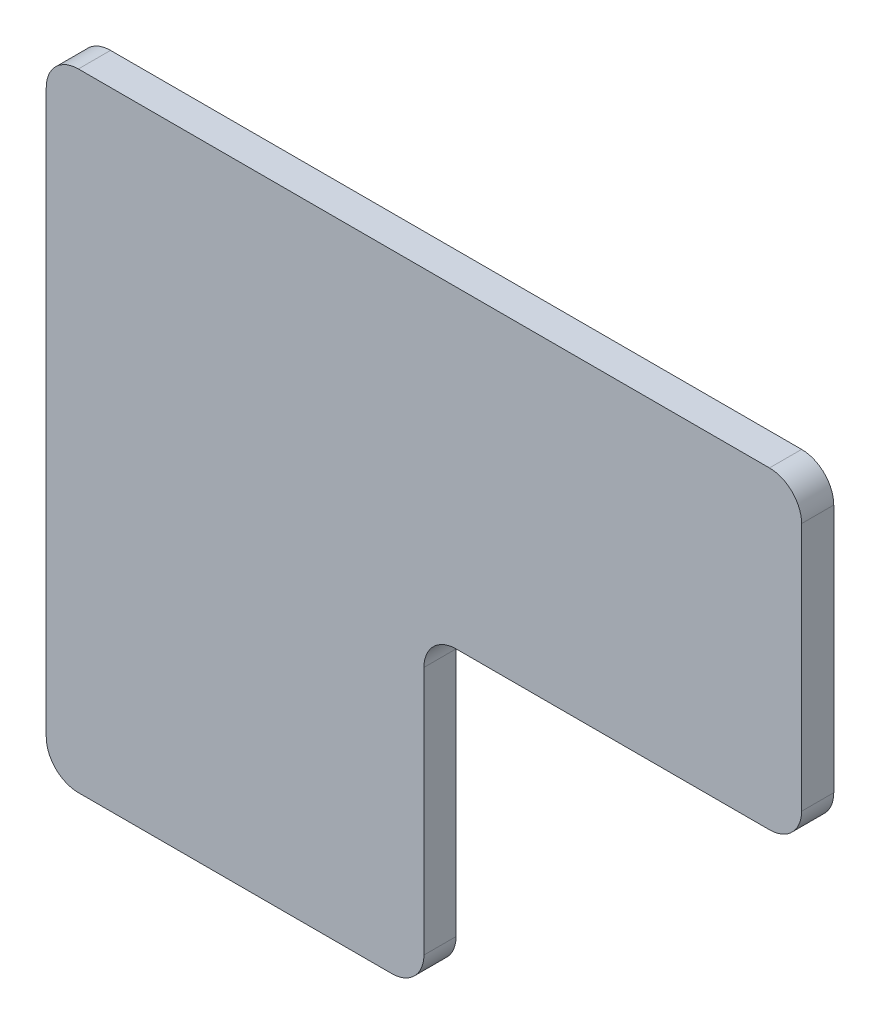
ISO-10303-21;
HEADER;
FILE_DESCRIPTION(('STEP AP214'),'2;1');
FILE_NAME('part.step','',(''),(''),'','','');
FILE_SCHEMA(('AUTOMOTIVE_DESIGN { 1 0 10303 214 1 1 1 1 }'));
ENDSEC;
DATA;
#1=APPLICATION_CONTEXT('core data for automotive mechanical design processes');
#2=APPLICATION_PROTOCOL_DEFINITION('international standard','automotive_design',2000,#1);
#3=PRODUCT_CONTEXT('',#1,'mechanical');
#4=PRODUCT('Part','Part','',(#3));
#5=PRODUCT_RELATED_PRODUCT_CATEGORY('part','',(#4));
#6=PRODUCT_DEFINITION_FORMATION('','',#4);
#7=PRODUCT_DEFINITION_CONTEXT('part definition',#1,'design');
#8=PRODUCT_DEFINITION('design','',#6,#7);
#9=PRODUCT_DEFINITION_SHAPE('','',#8);
#10=(LENGTH_UNIT() NAMED_UNIT(*) SI_UNIT(.MILLI.,.METRE.));
#11=(NAMED_UNIT(*) PLANE_ANGLE_UNIT() SI_UNIT($,.RADIAN.));
#12=(NAMED_UNIT(*) SI_UNIT($,.STERADIAN.) SOLID_ANGLE_UNIT());
#13=UNCERTAINTY_MEASURE_WITH_UNIT(LENGTH_MEASURE(1.E-05),#10,'distance_accuracy_value','');
#14=(GEOMETRIC_REPRESENTATION_CONTEXT(3) GLOBAL_UNCERTAINTY_ASSIGNED_CONTEXT((#13)) GLOBAL_UNIT_ASSIGNED_CONTEXT((#10,
#11,#12)) REPRESENTATION_CONTEXT('',''));
#15=CARTESIAN_POINT('',(0.,0.,0.));
#16=DIRECTION('',(0.,0.,1.));
#17=DIRECTION('',(1.,0.,0.));
#18=AXIS2_PLACEMENT_3D('',#15,#16,#17);
#19=CARTESIAN_POINT('',(0.,0.,16.));
#20=DIRECTION('',(0.,0.,1.));
#21=DIRECTION('',(1.,0.,0.));
#22=AXIS2_PLACEMENT_3D('',#19,#20,#21);
#23=PLANE('',#22);
#24=DIRECTION('',(1.,0.,0.));
#25=VECTOR('',#24,1.);
#26=CARTESIAN_POINT('',(-5.375,-4.875,16.));
#27=LINE('',#26,#25);
#28=CARTESIAN_POINT('',(-5.375,-4.875,16.));
#29=VERTEX_POINT('',#28);
#30=CARTESIAN_POINT('',(-0.5,-4.875,16.));
#31=VERTEX_POINT('',#30);
#32=EDGE_CURVE('E26',#29,#31,#27,.T.);
#33=ORIENTED_EDGE('',*,*,#32,.F.);
#34=CARTESIAN_POINT('',(-5.375,-4.375,16.));
#35=DIRECTION('',(0.,0.,1.));
#36=DIRECTION('',(-1.,0.,0.));
#37=AXIS2_PLACEMENT_3D('',#34,#35,#36);
#38=CIRCLE('',#37,0.5);
#39=CARTESIAN_POINT('',(-5.875,-4.375,16.));
#40=VERTEX_POINT('',#39);
#41=EDGE_CURVE('E282',#40,#29,#38,.T.);
#42=ORIENTED_EDGE('',*,*,#41,.F.);
#43=DIRECTION('',(0.,-1.,0.));
#44=VECTOR('',#43,1.);
#45=CARTESIAN_POINT('',(-5.875,4.375,16.));
#46=LINE('',#45,#44);
#47=CARTESIAN_POINT('',(-5.875,4.375,16.));
#48=VERTEX_POINT('',#47);
#49=EDGE_CURVE('E178',#48,#40,#46,.T.);
#50=ORIENTED_EDGE('',*,*,#49,.F.);
#51=CARTESIAN_POINT('',(-5.375,4.375,16.));
#52=DIRECTION('',(0.,0.,1.));
#53=DIRECTION('',(0.,1.,0.));
#54=AXIS2_PLACEMENT_3D('',#51,#52,#53);
#55=CIRCLE('',#54,0.5);
#56=CARTESIAN_POINT('',(-5.375,4.875,16.));
#57=VERTEX_POINT('',#56);
#58=EDGE_CURVE('E209',#57,#48,#55,.T.);
#59=ORIENTED_EDGE('',*,*,#58,.F.);
#60=DIRECTION('',(-1.,0.,0.));
#61=VECTOR('',#60,1.);
#62=CARTESIAN_POINT('',(5.375,4.875,16.));
#63=LINE('',#62,#61);
#64=CARTESIAN_POINT('',(5.375,4.875,16.));
#65=VERTEX_POINT('',#64);
#66=EDGE_CURVE('E249',#65,#57,#63,.T.);
#67=ORIENTED_EDGE('',*,*,#66,.F.);
#68=CARTESIAN_POINT('',(5.375,4.375,16.));
#69=DIRECTION('',(0.,0.,1.));
#70=DIRECTION('',(1.,0.,0.));
#71=AXIS2_PLACEMENT_3D('',#68,#69,#70);
#72=CIRCLE('',#71,0.5);
#73=CARTESIAN_POINT('',(5.875,4.375,16.));
#74=VERTEX_POINT('',#73);
#75=EDGE_CURVE('E227',#74,#65,#72,.T.);
#76=ORIENTED_EDGE('',*,*,#75,.F.);
#77=DIRECTION('',(0.,1.,0.));
#78=VECTOR('',#77,1.);
#79=CARTESIAN_POINT('',(5.875,-4.375,16.));
#80=LINE('',#79,#78);
#81=CARTESIAN_POINT('',(5.875,0.5,16.));
#82=VERTEX_POINT('',#81);
#83=EDGE_CURVE('E159',#82,#74,#80,.T.);
#84=ORIENTED_EDGE('',*,*,#83,.F.);
#85=CARTESIAN_POINT('',(5.375,0.5,16.));
#86=DIRECTION('',(0.,0.,1.));
#87=DIRECTION('',(0.,-1.,0.));
#88=AXIS2_PLACEMENT_3D('',#85,#86,#87);
#89=CIRCLE('',#88,0.5);
#90=CARTESIAN_POINT('',(5.375,0.,16.));
#91=VERTEX_POINT('',#90);
#92=EDGE_CURVE('E20',#91,#82,#89,.T.);
#93=ORIENTED_EDGE('',*,*,#92,.F.);
#94=DIRECTION('',(1.,0.,0.));
#95=VECTOR('',#94,1.);
#96=CARTESIAN_POINT('',(0.5,0.,16.));
#97=LINE('',#96,#95);
#98=CARTESIAN_POINT('',(0.5,0.,16.));
#99=VERTEX_POINT('',#98);
#100=EDGE_CURVE('E168',#99,#91,#97,.T.);
#101=ORIENTED_EDGE('',*,*,#100,.F.);
#102=CARTESIAN_POINT('',(0.5,-0.5,16.));
#103=DIRECTION('',(0.,0.,-1.));
#104=DIRECTION('',(0.,-1.,0.));
#105=AXIS2_PLACEMENT_3D('',#102,#103,#104);
#106=CIRCLE('',#105,0.5);
#107=CARTESIAN_POINT('',(0.,-0.5,16.));
#108=VERTEX_POINT('',#107);
#109=EDGE_CURVE('E173',#108,#99,#106,.T.);
#110=ORIENTED_EDGE('',*,*,#109,.F.);
#111=DIRECTION('',(0.,1.,0.));
#112=VECTOR('',#111,1.);
#113=CARTESIAN_POINT('',(0.,-4.375,16.));
#114=LINE('',#113,#112);
#115=CARTESIAN_POINT('',(0.,-4.375,16.));
#116=VERTEX_POINT('',#115);
#117=EDGE_CURVE('E185',#116,#108,#114,.T.);
#118=ORIENTED_EDGE('',*,*,#117,.F.);
#119=CARTESIAN_POINT('',(-0.5,-4.375,16.));
#120=DIRECTION('',(0.,0.,1.));
#121=DIRECTION('',(0.,-1.,0.));
#122=AXIS2_PLACEMENT_3D('',#119,#120,#121);
#123=CIRCLE('',#122,0.5);
#124=EDGE_CURVE('E195',#31,#116,#123,.T.);
#125=ORIENTED_EDGE('',*,*,#124,.F.);
#126=EDGE_LOOP('',(#33,#42,#50,#59,#67,#76,#84,#93,#101,#110,#118,#125));
#127=FACE_BOUND('',#126,.T.);
#128=ADVANCED_FACE('F16',(#127),#23,.F.);
#129=CARTESIAN_POINT('',(0.,0.,16.5));
#130=DIRECTION('',(0.,0.,1.));
#131=DIRECTION('',(1.,0.,0.));
#132=AXIS2_PLACEMENT_3D('',#129,#130,#131);
#133=PLANE('',#132);
#134=DIRECTION('',(1.,0.,0.));
#135=VECTOR('',#134,1.);
#136=CARTESIAN_POINT('',(-5.375,-4.875,16.5));
#137=LINE('',#136,#135);
#138=CARTESIAN_POINT('',(-5.375,-4.875,16.5));
#139=VERTEX_POINT('',#138);
#140=CARTESIAN_POINT('',(-0.5,-4.875,16.5));
#141=VERTEX_POINT('',#140);
#142=EDGE_CURVE('E11',#139,#141,#137,.T.);
#143=ORIENTED_EDGE('',*,*,#142,.T.);
#144=CARTESIAN_POINT('',(-0.5,-4.375,16.5));
#145=DIRECTION('',(0.,0.,1.));
#146=DIRECTION('',(0.,-1.,0.));
#147=AXIS2_PLACEMENT_3D('',#144,#145,#146);
#148=CIRCLE('',#147,0.5);
#149=CARTESIAN_POINT('',(0.,-4.375,16.5));
#150=VERTEX_POINT('',#149);
#151=EDGE_CURVE('E188',#141,#150,#148,.T.);
#152=ORIENTED_EDGE('',*,*,#151,.T.);
#153=DIRECTION('',(0.,1.,0.));
#154=VECTOR('',#153,1.);
#155=CARTESIAN_POINT('',(0.,-4.375,16.5));
#156=LINE('',#155,#154);
#157=CARTESIAN_POINT('',(0.,-0.5,16.5));
#158=VERTEX_POINT('',#157);
#159=EDGE_CURVE('E212',#150,#158,#156,.T.);
#160=ORIENTED_EDGE('',*,*,#159,.T.);
#161=CARTESIAN_POINT('',(0.5,-0.5,16.5));
#162=DIRECTION('',(0.,0.,-1.));
#163=DIRECTION('',(0.,-1.,0.));
#164=AXIS2_PLACEMENT_3D('',#161,#162,#163);
#165=CIRCLE('',#164,0.5);
#166=CARTESIAN_POINT('',(0.5,0.,16.5));
#167=VERTEX_POINT('',#166);
#168=EDGE_CURVE('E170',#158,#167,#165,.T.);
#169=ORIENTED_EDGE('',*,*,#168,.T.);
#170=DIRECTION('',(1.,0.,0.));
#171=VECTOR('',#170,1.);
#172=CARTESIAN_POINT('',(0.5,0.,16.5));
#173=LINE('',#172,#171);
#174=CARTESIAN_POINT('',(5.375,0.,16.5));
#175=VERTEX_POINT('',#174);
#176=EDGE_CURVE('E139',#167,#175,#173,.T.);
#177=ORIENTED_EDGE('',*,*,#176,.T.);
#178=CARTESIAN_POINT('',(5.375,0.5,16.5));
#179=DIRECTION('',(0.,0.,1.));
#180=DIRECTION('',(0.,-1.,0.));
#181=AXIS2_PLACEMENT_3D('',#178,#179,#180);
#182=CIRCLE('',#181,0.5);
#183=CARTESIAN_POINT('',(5.875,0.5,16.5));
#184=VERTEX_POINT('',#183);
#185=EDGE_CURVE('E133',#175,#184,#182,.T.);
#186=ORIENTED_EDGE('',*,*,#185,.T.);
#187=DIRECTION('',(0.,1.,0.));
#188=VECTOR('',#187,1.);
#189=CARTESIAN_POINT('',(5.875,-4.375,16.5));
#190=LINE('',#189,#188);
#191=CARTESIAN_POINT('',(5.875,4.375,16.5));
#192=VERTEX_POINT('',#191);
#193=EDGE_CURVE('E136',#184,#192,#190,.T.);
#194=ORIENTED_EDGE('',*,*,#193,.T.);
#195=CARTESIAN_POINT('',(5.375,4.375,16.5));
#196=DIRECTION('',(0.,0.,1.));
#197=DIRECTION('',(1.,0.,0.));
#198=AXIS2_PLACEMENT_3D('',#195,#196,#197);
#199=CIRCLE('',#198,0.5);
#200=CARTESIAN_POINT('',(5.375,4.875,16.5));
#201=VERTEX_POINT('',#200);
#202=EDGE_CURVE('E224',#192,#201,#199,.T.);
#203=ORIENTED_EDGE('',*,*,#202,.T.);
#204=DIRECTION('',(-1.,0.,0.));
#205=VECTOR('',#204,1.);
#206=CARTESIAN_POINT('',(5.375,4.875,16.5));
#207=LINE('',#206,#205);
#208=CARTESIAN_POINT('',(-5.375,4.875,16.5));
#209=VERTEX_POINT('',#208);
#210=EDGE_CURVE('E252',#201,#209,#207,.T.);
#211=ORIENTED_EDGE('',*,*,#210,.T.);
#212=CARTESIAN_POINT('',(-5.375,4.375,16.5));
#213=DIRECTION('',(0.,0.,1.));
#214=DIRECTION('',(0.,1.,0.));
#215=AXIS2_PLACEMENT_3D('',#212,#213,#214);
#216=CIRCLE('',#215,0.5);
#217=CARTESIAN_POINT('',(-5.875,4.375,16.5));
#218=VERTEX_POINT('',#217);
#219=EDGE_CURVE('E206',#209,#218,#216,.T.);
#220=ORIENTED_EDGE('',*,*,#219,.T.);
#221=DIRECTION('',(0.,-1.,0.));
#222=VECTOR('',#221,1.);
#223=CARTESIAN_POINT('',(-5.875,4.375,16.5));
#224=LINE('',#223,#222);
#225=CARTESIAN_POINT('',(-5.875,-4.375,16.5));
#226=VERTEX_POINT('',#225);
#227=EDGE_CURVE('E203',#218,#226,#224,.T.);
#228=ORIENTED_EDGE('',*,*,#227,.T.);
#229=CARTESIAN_POINT('',(-5.375,-4.375,16.5));
#230=DIRECTION('',(0.,0.,1.));
#231=DIRECTION('',(-1.,0.,0.));
#232=AXIS2_PLACEMENT_3D('',#229,#230,#231);
#233=CIRCLE('',#232,0.5);
#234=EDGE_CURVE('E179',#226,#139,#233,.T.);
#235=ORIENTED_EDGE('',*,*,#234,.T.);
#236=EDGE_LOOP('',(#143,#152,#160,#169,#177,#186,#194,#203,#211,#220,#228,#235));
#237=FACE_BOUND('',#236,.T.);
#238=ADVANCED_FACE('F18',(#237),#133,.T.);
#239=CARTESIAN_POINT('',(-5.375,-4.875,16.));
#240=DIRECTION('',(0.,-1.,0.));
#241=DIRECTION('',(0.,0.,-1.));
#242=AXIS2_PLACEMENT_3D('',#239,#240,#241);
#243=PLANE('',#242);
#244=ORIENTED_EDGE('',*,*,#32,.T.);
#245=DIRECTION('',(0.,0.,1.));
#246=VECTOR('',#245,1.);
#247=CARTESIAN_POINT('',(-0.5,-4.875,16.));
#248=LINE('',#247,#246);
#249=EDGE_CURVE('E186',#31,#141,#248,.T.);
#250=ORIENTED_EDGE('',*,*,#249,.T.);
#251=ORIENTED_EDGE('',*,*,#142,.F.);
#252=DIRECTION('',(0.,0.,1.));
#253=VECTOR('',#252,1.);
#254=CARTESIAN_POINT('',(-5.375,-4.875,16.));
#255=LINE('',#254,#253);
#256=EDGE_CURVE('E182',#29,#139,#255,.T.);
#257=ORIENTED_EDGE('',*,*,#256,.F.);
#258=EDGE_LOOP('',(#244,#250,#251,#257));
#259=FACE_BOUND('',#258,.T.);
#260=ADVANCED_FACE('F304',(#259),#243,.T.);
#261=CARTESIAN_POINT('',(-0.5,-4.375,16.));
#262=DIRECTION('',(0.,0.,1.));
#263=DIRECTION('',(0.,-1.,0.));
#264=AXIS2_PLACEMENT_3D('',#261,#262,#263);
#265=CYLINDRICAL_SURFACE('',#264,0.5);
#266=ORIENTED_EDGE('',*,*,#124,.T.);
#267=DIRECTION('',(0.,0.,1.));
#268=VECTOR('',#267,1.);
#269=CARTESIAN_POINT('',(0.,-4.375,16.));
#270=LINE('',#269,#268);
#271=EDGE_CURVE('E201',#116,#150,#270,.T.);
#272=ORIENTED_EDGE('',*,*,#271,.T.);
#273=ORIENTED_EDGE('',*,*,#151,.F.);
#274=ORIENTED_EDGE('',*,*,#249,.F.);
#275=EDGE_LOOP('',(#266,#272,#273,#274));
#276=FACE_BOUND('',#275,.T.);
#277=ADVANCED_FACE('F306',(#276),#265,.T.);
#278=CARTESIAN_POINT('',(0.,-4.375,16.));
#279=DIRECTION('',(1.,0.,0.));
#280=DIRECTION('',(0.,1.,0.));
#281=AXIS2_PLACEMENT_3D('',#278,#279,#280);
#282=PLANE('',#281);
#283=ORIENTED_EDGE('',*,*,#117,.T.);
#284=DIRECTION('',(0.,0.,1.));
#285=VECTOR('',#284,1.);
#286=CARTESIAN_POINT('',(0.,-0.5,16.));
#287=LINE('',#286,#285);
#288=EDGE_CURVE('E172',#108,#158,#287,.T.);
#289=ORIENTED_EDGE('',*,*,#288,.T.);
#290=ORIENTED_EDGE('',*,*,#159,.F.);
#291=ORIENTED_EDGE('',*,*,#271,.F.);
#292=EDGE_LOOP('',(#283,#289,#290,#291));
#293=FACE_BOUND('',#292,.T.);
#294=ADVANCED_FACE('F313',(#293),#282,.T.);
#295=CARTESIAN_POINT('',(0.5,-0.5,16.));
#296=DIRECTION('',(0.,0.,1.));
#297=DIRECTION('',(0.,-1.,0.));
#298=AXIS2_PLACEMENT_3D('',#295,#296,#297);
#299=CYLINDRICAL_SURFACE('',#298,0.5);
#300=ORIENTED_EDGE('',*,*,#109,.T.);
#301=DIRECTION('',(0.,0.,1.));
#302=VECTOR('',#301,1.);
#303=CARTESIAN_POINT('',(0.5,0.,16.));
#304=LINE('',#303,#302);
#305=EDGE_CURVE('E216',#99,#167,#304,.T.);
#306=ORIENTED_EDGE('',*,*,#305,.T.);
#307=ORIENTED_EDGE('',*,*,#168,.F.);
#308=ORIENTED_EDGE('',*,*,#288,.F.);
#309=EDGE_LOOP('',(#300,#306,#307,#308));
#310=FACE_BOUND('',#309,.T.);
#311=ADVANCED_FACE('F328',(#310),#299,.F.);
#312=CARTESIAN_POINT('',(0.5,0.,16.));
#313=DIRECTION('',(0.,-1.,0.));
#314=DIRECTION('',(0.,0.,-1.));
#315=AXIS2_PLACEMENT_3D('',#312,#313,#314);
#316=PLANE('',#315);
#317=ORIENTED_EDGE('',*,*,#100,.T.);
#318=DIRECTION('',(0.,0.,1.));
#319=VECTOR('',#318,1.);
#320=CARTESIAN_POINT('',(5.375,0.,16.));
#321=LINE('',#320,#319);
#322=EDGE_CURVE('E144',#91,#175,#321,.T.);
#323=ORIENTED_EDGE('',*,*,#322,.T.);
#324=ORIENTED_EDGE('',*,*,#176,.F.);
#325=ORIENTED_EDGE('',*,*,#305,.F.);
#326=EDGE_LOOP('',(#317,#323,#324,#325));
#327=FACE_BOUND('',#326,.T.);
#328=ADVANCED_FACE('F326',(#327),#316,.T.);
#329=CARTESIAN_POINT('',(5.375,0.5,16.));
#330=DIRECTION('',(0.,0.,1.));
#331=DIRECTION('',(0.,-1.,0.));
#332=AXIS2_PLACEMENT_3D('',#329,#330,#331);
#333=CYLINDRICAL_SURFACE('',#332,0.5);
#334=ORIENTED_EDGE('',*,*,#92,.T.);
#335=DIRECTION('',(0.,0.,1.));
#336=VECTOR('',#335,1.);
#337=CARTESIAN_POINT('',(5.875,0.5,16.));
#338=LINE('',#337,#336);
#339=EDGE_CURVE('E147',#82,#184,#338,.T.);
#340=ORIENTED_EDGE('',*,*,#339,.T.);
#341=ORIENTED_EDGE('',*,*,#185,.F.);
#342=ORIENTED_EDGE('',*,*,#322,.F.);
#343=EDGE_LOOP('',(#334,#340,#341,#342));
#344=FACE_BOUND('',#343,.T.);
#345=ADVANCED_FACE('F148',(#344),#333,.T.);
#346=CARTESIAN_POINT('',(5.875,0.5,16.));
#347=DIRECTION('',(1.,0.,0.));
#348=DIRECTION('',(0.,1.,0.));
#349=AXIS2_PLACEMENT_3D('',#346,#347,#348);
#350=PLANE('',#349);
#351=ORIENTED_EDGE('',*,*,#83,.T.);
#352=DIRECTION('',(0.,0.,1.));
#353=VECTOR('',#352,1.);
#354=CARTESIAN_POINT('',(5.875,4.375,16.));
#355=LINE('',#354,#353);
#356=EDGE_CURVE('E156',#74,#192,#355,.T.);
#357=ORIENTED_EDGE('',*,*,#356,.T.);
#358=ORIENTED_EDGE('',*,*,#193,.F.);
#359=ORIENTED_EDGE('',*,*,#339,.F.);
#360=EDGE_LOOP('',(#351,#357,#358,#359));
#361=FACE_BOUND('',#360,.T.);
#362=ADVANCED_FACE('F154',(#361),#350,.T.);
#363=CARTESIAN_POINT('',(5.375,4.375,16.));
#364=DIRECTION('',(0.,0.,1.));
#365=DIRECTION('',(1.,0.,0.));
#366=AXIS2_PLACEMENT_3D('',#363,#364,#365);
#367=CYLINDRICAL_SURFACE('',#366,0.5);
#368=ORIENTED_EDGE('',*,*,#75,.T.);
#369=DIRECTION('',(0.,0.,1.));
#370=VECTOR('',#369,1.);
#371=CARTESIAN_POINT('',(5.375,4.875,16.));
#372=LINE('',#371,#370);
#373=EDGE_CURVE('E272',#65,#201,#372,.T.);
#374=ORIENTED_EDGE('',*,*,#373,.T.);
#375=ORIENTED_EDGE('',*,*,#202,.F.);
#376=ORIENTED_EDGE('',*,*,#356,.F.);
#377=EDGE_LOOP('',(#368,#374,#375,#376));
#378=FACE_BOUND('',#377,.T.);
#379=ADVANCED_FACE('F294',(#378),#367,.T.);
#380=CARTESIAN_POINT('',(5.375,4.875,16.));
#381=DIRECTION('',(0.,1.,0.));
#382=DIRECTION('',(1.,0.,0.));
#383=AXIS2_PLACEMENT_3D('',#380,#381,#382);
#384=PLANE('',#383);
#385=ORIENTED_EDGE('',*,*,#66,.T.);
#386=DIRECTION('',(0.,0.,1.));
#387=VECTOR('',#386,1.);
#388=CARTESIAN_POINT('',(-5.375,4.875,16.));
#389=LINE('',#388,#387);
#390=EDGE_CURVE('E208',#57,#209,#389,.T.);
#391=ORIENTED_EDGE('',*,*,#390,.T.);
#392=ORIENTED_EDGE('',*,*,#210,.F.);
#393=ORIENTED_EDGE('',*,*,#373,.F.);
#394=EDGE_LOOP('',(#385,#391,#392,#393));
#395=FACE_BOUND('',#394,.T.);
#396=ADVANCED_FACE('F261',(#395),#384,.T.);
#397=CARTESIAN_POINT('',(-5.375,4.375,16.));
#398=DIRECTION('',(0.,0.,1.));
#399=DIRECTION('',(0.,1.,0.));
#400=AXIS2_PLACEMENT_3D('',#397,#398,#399);
#401=CYLINDRICAL_SURFACE('',#400,0.5);
#402=ORIENTED_EDGE('',*,*,#58,.T.);
#403=DIRECTION('',(0.,0.,1.));
#404=VECTOR('',#403,1.);
#405=CARTESIAN_POINT('',(-5.875,4.375,16.));
#406=LINE('',#405,#404);
#407=EDGE_CURVE('E248',#48,#218,#406,.T.);
#408=ORIENTED_EDGE('',*,*,#407,.T.);
#409=ORIENTED_EDGE('',*,*,#219,.F.);
#410=ORIENTED_EDGE('',*,*,#390,.F.);
#411=EDGE_LOOP('',(#402,#408,#409,#410));
#412=FACE_BOUND('',#411,.T.);
#413=ADVANCED_FACE('F267',(#412),#401,.T.);
#414=CARTESIAN_POINT('',(-5.875,4.375,16.));
#415=DIRECTION('',(-1.,0.,0.));
#416=DIRECTION('',(0.,0.,1.));
#417=AXIS2_PLACEMENT_3D('',#414,#415,#416);
#418=PLANE('',#417);
#419=ORIENTED_EDGE('',*,*,#49,.T.);
#420=DIRECTION('',(0.,0.,1.));
#421=VECTOR('',#420,1.);
#422=CARTESIAN_POINT('',(-5.875,-4.375,16.));
#423=LINE('',#422,#421);
#424=EDGE_CURVE('E174',#40,#226,#423,.T.);
#425=ORIENTED_EDGE('',*,*,#424,.T.);
#426=ORIENTED_EDGE('',*,*,#227,.F.);
#427=ORIENTED_EDGE('',*,*,#407,.F.);
#428=EDGE_LOOP('',(#419,#425,#426,#427));
#429=FACE_BOUND('',#428,.T.);
#430=ADVANCED_FACE('F299',(#429),#418,.T.);
#431=CARTESIAN_POINT('',(-5.375,-4.375,16.));
#432=DIRECTION('',(0.,0.,1.));
#433=DIRECTION('',(-1.,0.,0.));
#434=AXIS2_PLACEMENT_3D('',#431,#432,#433);
#435=CYLINDRICAL_SURFACE('',#434,0.5);
#436=ORIENTED_EDGE('',*,*,#41,.T.);
#437=ORIENTED_EDGE('',*,*,#256,.T.);
#438=ORIENTED_EDGE('',*,*,#234,.F.);
#439=ORIENTED_EDGE('',*,*,#424,.F.);
#440=EDGE_LOOP('',(#436,#437,#438,#439));
#441=FACE_BOUND('',#440,.T.);
#442=ADVANCED_FACE('F303',(#441),#435,.T.);
#443=CLOSED_SHELL('',(#128,#238,#260,#277,#294,#311,#328,#345,#362,#379,#396,#413,#430,#442));
#444=MANIFOLD_SOLID_BREP('B1',#443);
#445=ADVANCED_BREP_SHAPE_REPRESENTATION('',(#18,#444),#14);
#446=SHAPE_DEFINITION_REPRESENTATION(#9,#445);
ENDSEC;
END-ISO-10303-21;
